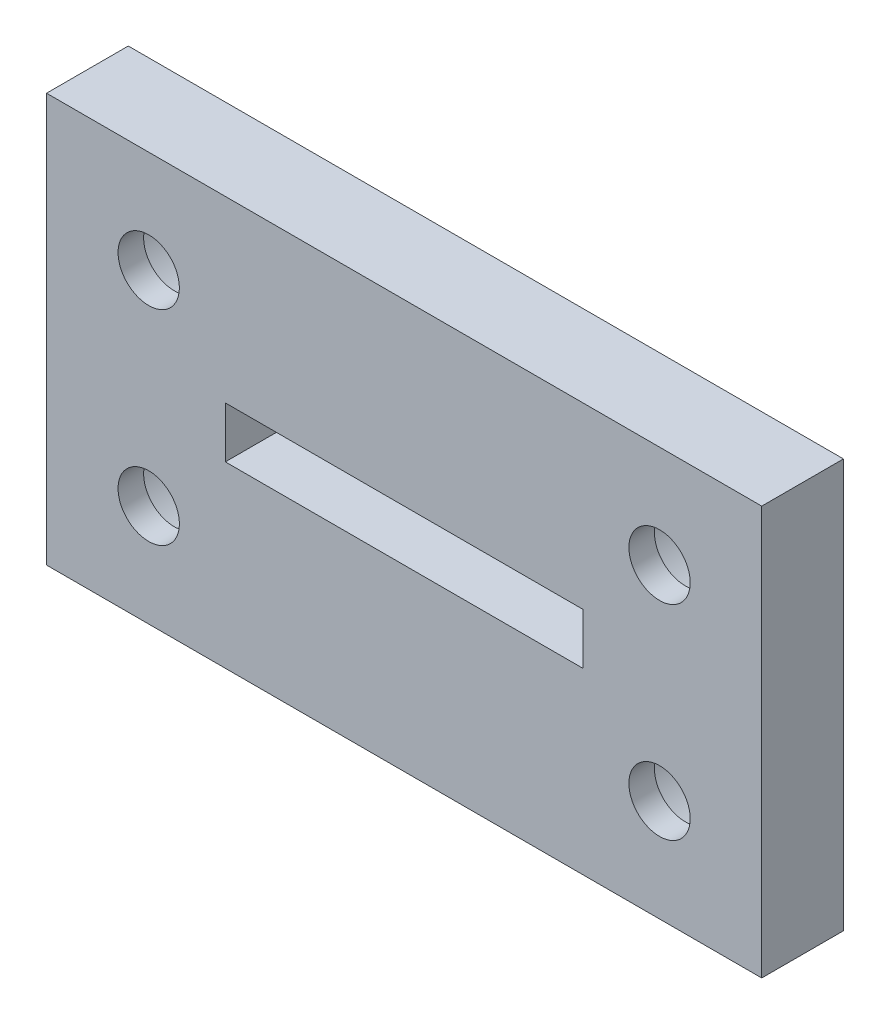
ISO-10303-21;
HEADER;
FILE_DESCRIPTION(('STEP AP214'),'2;1');
FILE_NAME('part.step','',(''),(''),'','','');
FILE_SCHEMA(('AUTOMOTIVE_DESIGN { 1 0 10303 214 1 1 1 1 }'));
ENDSEC;
DATA;
#1=APPLICATION_CONTEXT('core data for automotive mechanical design processes');
#2=APPLICATION_PROTOCOL_DEFINITION('international standard','automotive_design',2000,#1);
#3=PRODUCT_CONTEXT('',#1,'mechanical');
#4=PRODUCT('Part','Part','',(#3));
#5=PRODUCT_RELATED_PRODUCT_CATEGORY('part','',(#4));
#6=PRODUCT_DEFINITION_FORMATION('','',#4);
#7=PRODUCT_DEFINITION_CONTEXT('part definition',#1,'design');
#8=PRODUCT_DEFINITION('design','',#6,#7);
#9=PRODUCT_DEFINITION_SHAPE('','',#8);
#10=(LENGTH_UNIT() NAMED_UNIT(*) SI_UNIT(.MILLI.,.METRE.));
#11=(NAMED_UNIT(*) PLANE_ANGLE_UNIT() SI_UNIT($,.RADIAN.));
#12=(NAMED_UNIT(*) SI_UNIT($,.STERADIAN.) SOLID_ANGLE_UNIT());
#13=UNCERTAINTY_MEASURE_WITH_UNIT(LENGTH_MEASURE(1.E-05),#10,'distance_accuracy_value','');
#14=(GEOMETRIC_REPRESENTATION_CONTEXT(3) GLOBAL_UNCERTAINTY_ASSIGNED_CONTEXT((#13)) GLOBAL_UNIT_ASSIGNED_CONTEXT((#10,
#11,#12)) REPRESENTATION_CONTEXT('',''));
#15=CARTESIAN_POINT('',(0.,0.,0.));
#16=DIRECTION('',(0.,0.,1.));
#17=DIRECTION('',(1.,0.,0.));
#18=AXIS2_PLACEMENT_3D('',#15,#16,#17);
#19=CARTESIAN_POINT('',(4.,4.,3.2));
#20=DIRECTION('',(0.,0.,-1.));
#21=DIRECTION('',(-1.,0.,0.));
#22=AXIS2_PLACEMENT_3D('',#19,#20,#21);
#23=CYLINDRICAL_SURFACE('',#22,1.2);
#24=CARTESIAN_POINT('',(4.,4.,3.2));
#25=DIRECTION('',(0.,0.,1.));
#26=DIRECTION('',(-1.,0.,0.));
#27=AXIS2_PLACEMENT_3D('',#24,#25,#26);
#28=CIRCLE('',#27,1.2);
#29=CARTESIAN_POINT('',(2.8,4.,3.2));
#30=VERTEX_POINT('',#29);
#31=EDGE_CURVE('E196',#30,#30,#28,.T.);
#32=ORIENTED_EDGE('',*,*,#31,.T.);
#33=EDGE_LOOP('',(#32));
#34=FACE_BOUND('',#33,.T.);
#35=CARTESIAN_POINT('',(4.,4.,2.2));
#36=DIRECTION('',(0.,0.,-1.));
#37=DIRECTION('',(-1.,0.,0.));
#38=AXIS2_PLACEMENT_3D('',#35,#36,#37);
#39=CIRCLE('',#38,1.2);
#40=CARTESIAN_POINT('',(2.8,4.,2.2));
#41=VERTEX_POINT('',#40);
#42=EDGE_CURVE('E39',#41,#41,#39,.T.);
#43=ORIENTED_EDGE('',*,*,#42,.T.);
#44=EDGE_LOOP('',(#43));
#45=FACE_BOUND('',#44,.T.);
#46=ADVANCED_FACE('F35',(#34,#45),#23,.F.);
#47=CARTESIAN_POINT('',(24.,4.,3.2));
#48=DIRECTION('',(0.,0.,-1.));
#49=DIRECTION('',(-1.,0.,0.));
#50=AXIS2_PLACEMENT_3D('',#47,#48,#49);
#51=CYLINDRICAL_SURFACE('',#50,1.2);
#52=CARTESIAN_POINT('',(24.,4.,3.2));
#53=DIRECTION('',(0.,0.,1.));
#54=DIRECTION('',(1.,0.,0.));
#55=AXIS2_PLACEMENT_3D('',#52,#53,#54);
#56=CIRCLE('',#55,1.2);
#57=CARTESIAN_POINT('',(25.2,4.,3.2));
#58=VERTEX_POINT('',#57);
#59=EDGE_CURVE('E193',#58,#58,#56,.T.);
#60=ORIENTED_EDGE('',*,*,#59,.T.);
#61=EDGE_LOOP('',(#60));
#62=FACE_BOUND('',#61,.T.);
#63=CARTESIAN_POINT('',(24.,4.,2.2));
#64=DIRECTION('',(0.,0.,-1.));
#65=DIRECTION('',(-1.,0.,0.));
#66=AXIS2_PLACEMENT_3D('',#63,#64,#65);
#67=CIRCLE('',#66,1.2);
#68=CARTESIAN_POINT('',(22.8,4.,2.2));
#69=VERTEX_POINT('',#68);
#70=EDGE_CURVE('E174',#69,#69,#67,.T.);
#71=ORIENTED_EDGE('',*,*,#70,.T.);
#72=EDGE_LOOP('',(#71));
#73=FACE_BOUND('',#72,.T.);
#74=ADVANCED_FACE('F217',(#62,#73),#51,.F.);
#75=CARTESIAN_POINT('',(24.,12.,3.2));
#76=DIRECTION('',(0.,0.,-1.));
#77=DIRECTION('',(-1.,0.,0.));
#78=AXIS2_PLACEMENT_3D('',#75,#76,#77);
#79=CYLINDRICAL_SURFACE('',#78,1.2);
#80=CARTESIAN_POINT('',(24.,12.,3.2));
#81=DIRECTION('',(0.,0.,1.));
#82=DIRECTION('',(-1.,0.,0.));
#83=AXIS2_PLACEMENT_3D('',#80,#81,#82);
#84=CIRCLE('',#83,1.2);
#85=CARTESIAN_POINT('',(22.8,12.,3.2));
#86=VERTEX_POINT('',#85);
#87=EDGE_CURVE('E170',#86,#86,#84,.T.);
#88=ORIENTED_EDGE('',*,*,#87,.T.);
#89=EDGE_LOOP('',(#88));
#90=FACE_BOUND('',#89,.T.);
#91=CARTESIAN_POINT('',(24.,12.,2.2));
#92=DIRECTION('',(0.,0.,-1.));
#93=DIRECTION('',(-1.,0.,0.));
#94=AXIS2_PLACEMENT_3D('',#91,#92,#93);
#95=CIRCLE('',#94,1.2);
#96=CARTESIAN_POINT('',(22.8,12.,2.2));
#97=VERTEX_POINT('',#96);
#98=EDGE_CURVE('E172',#97,#97,#95,.T.);
#99=ORIENTED_EDGE('',*,*,#98,.T.);
#100=EDGE_LOOP('',(#99));
#101=FACE_BOUND('',#100,.T.);
#102=ADVANCED_FACE('F214',(#90,#101),#79,.F.);
#103=CARTESIAN_POINT('',(4.,12.,3.2));
#104=DIRECTION('',(0.,0.,-1.));
#105=DIRECTION('',(-1.,0.,0.));
#106=AXIS2_PLACEMENT_3D('',#103,#104,#105);
#107=CYLINDRICAL_SURFACE('',#106,1.2);
#108=CARTESIAN_POINT('',(4.,12.,3.2));
#109=DIRECTION('',(0.,0.,1.));
#110=DIRECTION('',(1.,0.,0.));
#111=AXIS2_PLACEMENT_3D('',#108,#109,#110);
#112=CIRCLE('',#111,1.2);
#113=CARTESIAN_POINT('',(5.2,12.,3.2));
#114=VERTEX_POINT('',#113);
#115=EDGE_CURVE('E132',#114,#114,#112,.T.);
#116=ORIENTED_EDGE('',*,*,#115,.T.);
#117=EDGE_LOOP('',(#116));
#118=FACE_BOUND('',#117,.T.);
#119=CARTESIAN_POINT('',(4.,12.,2.2));
#120=DIRECTION('',(0.,0.,-1.));
#121=DIRECTION('',(-1.,0.,0.));
#122=AXIS2_PLACEMENT_3D('',#119,#120,#121);
#123=CIRCLE('',#122,1.2);
#124=CARTESIAN_POINT('',(2.8,12.,2.2));
#125=VERTEX_POINT('',#124);
#126=EDGE_CURVE('E167',#125,#125,#123,.T.);
#127=ORIENTED_EDGE('',*,*,#126,.T.);
#128=EDGE_LOOP('',(#127));
#129=FACE_BOUND('',#128,.T.);
#130=ADVANCED_FACE('F201',(#118,#129),#107,.F.);
#131=CARTESIAN_POINT('',(0.,0.,3.2));
#132=DIRECTION('',(0.,0.,-1.));
#133=DIRECTION('',(-1.,0.,0.));
#134=AXIS2_PLACEMENT_3D('',#131,#132,#133);
#135=PLANE('',#134);
#136=DIRECTION('',(0.,-1.,0.));
#137=VECTOR('',#136,1.);
#138=CARTESIAN_POINT('',(0.,0.,3.2));
#139=LINE('',#138,#137);
#140=CARTESIAN_POINT('',(0.,16.,3.2));
#141=VERTEX_POINT('',#140);
#142=CARTESIAN_POINT('',(0.,0.,3.2));
#143=VERTEX_POINT('',#142);
#144=EDGE_CURVE('E142',#141,#143,#139,.T.);
#145=ORIENTED_EDGE('',*,*,#144,.T.);
#146=DIRECTION('',(1.,0.,0.));
#147=VECTOR('',#146,1.);
#148=CARTESIAN_POINT('',(0.,0.,3.2));
#149=LINE('',#148,#147);
#150=CARTESIAN_POINT('',(28.,0.,3.2));
#151=VERTEX_POINT('',#150);
#152=EDGE_CURVE('E145',#143,#151,#149,.T.);
#153=ORIENTED_EDGE('',*,*,#152,.T.);
#154=DIRECTION('',(0.,1.,0.));
#155=VECTOR('',#154,1.);
#156=CARTESIAN_POINT('',(28.,0.,3.2));
#157=LINE('',#156,#155);
#158=CARTESIAN_POINT('',(28.,16.,3.2));
#159=VERTEX_POINT('',#158);
#160=EDGE_CURVE('E148',#151,#159,#157,.T.);
#161=ORIENTED_EDGE('',*,*,#160,.T.);
#162=DIRECTION('',(-1.,0.,0.));
#163=VECTOR('',#162,1.);
#164=CARTESIAN_POINT('',(0.,16.,3.2));
#165=LINE('',#164,#163);
#166=EDGE_CURVE('E150',#159,#141,#165,.T.);
#167=ORIENTED_EDGE('',*,*,#166,.T.);
#168=EDGE_LOOP('',(#145,#153,#161,#167));
#169=FACE_BOUND('',#168,.T.);
#170=DIRECTION('',(0.,-1.,0.));
#171=VECTOR('',#170,1.);
#172=CARTESIAN_POINT('',(7.,7.,3.2));
#173=LINE('',#172,#171);
#174=CARTESIAN_POINT('',(7.,9.,3.2));
#175=VERTEX_POINT('',#174);
#176=CARTESIAN_POINT('',(7.,7.,3.2));
#177=VERTEX_POINT('',#176);
#178=EDGE_CURVE('E102',#175,#177,#173,.T.);
#179=ORIENTED_EDGE('',*,*,#178,.F.);
#180=DIRECTION('',(-1.,0.,0.));
#181=VECTOR('',#180,1.);
#182=CARTESIAN_POINT('',(7.,9.,3.2));
#183=LINE('',#182,#181);
#184=CARTESIAN_POINT('',(21.,9.,3.2));
#185=VERTEX_POINT('',#184);
#186=EDGE_CURVE('E126',#185,#175,#183,.T.);
#187=ORIENTED_EDGE('',*,*,#186,.F.);
#188=DIRECTION('',(0.,1.,0.));
#189=VECTOR('',#188,1.);
#190=CARTESIAN_POINT('',(21.,7.,3.2));
#191=LINE('',#190,#189);
#192=CARTESIAN_POINT('',(21.,7.,3.2));
#193=VERTEX_POINT('',#192);
#194=EDGE_CURVE('E124',#193,#185,#191,.T.);
#195=ORIENTED_EDGE('',*,*,#194,.F.);
#196=DIRECTION('',(1.,0.,0.));
#197=VECTOR('',#196,1.);
#198=CARTESIAN_POINT('',(7.,7.,3.2));
#199=LINE('',#198,#197);
#200=EDGE_CURVE('E110',#177,#193,#199,.T.);
#201=ORIENTED_EDGE('',*,*,#200,.F.);
#202=EDGE_LOOP('',(#179,#187,#195,#201));
#203=FACE_BOUND('',#202,.T.);
#204=ORIENTED_EDGE('',*,*,#115,.F.);
#205=EDGE_LOOP('',(#204));
#206=FACE_BOUND('',#205,.T.);
#207=ORIENTED_EDGE('',*,*,#31,.F.);
#208=EDGE_LOOP('',(#207));
#209=FACE_BOUND('',#208,.T.);
#210=ORIENTED_EDGE('',*,*,#59,.F.);
#211=EDGE_LOOP('',(#210));
#212=FACE_BOUND('',#211,.T.);
#213=ORIENTED_EDGE('',*,*,#87,.F.);
#214=EDGE_LOOP('',(#213));
#215=FACE_BOUND('',#214,.T.);
#216=ADVANCED_FACE('F122',(#169,#203,#206,#209,#212,#215),#135,.F.);
#217=CARTESIAN_POINT('',(0.,0.,0.));
#218=DIRECTION('',(0.,0.,-1.));
#219=DIRECTION('',(-1.,0.,0.));
#220=AXIS2_PLACEMENT_3D('',#217,#218,#219);
#221=PLANE('',#220);
#222=CARTESIAN_POINT('',(4.,4.,0.));
#223=DIRECTION('',(0.,0.,-1.));
#224=DIRECTION('',(-1.,0.,0.));
#225=AXIS2_PLACEMENT_3D('',#222,#223,#224);
#226=CIRCLE('',#225,3.);
#227=CARTESIAN_POINT('',(1.,4.,0.));
#228=VERTEX_POINT('',#227);
#229=EDGE_CURVE('E241',#228,#228,#226,.T.);
#230=ORIENTED_EDGE('',*,*,#229,.F.);
#231=EDGE_LOOP('',(#230));
#232=FACE_BOUND('',#231,.T.);
#233=CARTESIAN_POINT('',(24.,4.,0.));
#234=DIRECTION('',(0.,0.,-1.));
#235=DIRECTION('',(-1.,0.,0.));
#236=AXIS2_PLACEMENT_3D('',#233,#234,#235);
#237=CIRCLE('',#236,3.);
#238=CARTESIAN_POINT('',(21.,4.,0.));
#239=VERTEX_POINT('',#238);
#240=EDGE_CURVE('E231',#239,#239,#237,.T.);
#241=ORIENTED_EDGE('',*,*,#240,.F.);
#242=EDGE_LOOP('',(#241));
#243=FACE_BOUND('',#242,.T.);
#244=CARTESIAN_POINT('',(24.,12.,0.));
#245=DIRECTION('',(0.,0.,-1.));
#246=DIRECTION('',(-1.,0.,0.));
#247=AXIS2_PLACEMENT_3D('',#244,#245,#246);
#248=CIRCLE('',#247,3.);
#249=CARTESIAN_POINT('',(21.,12.,0.));
#250=VERTEX_POINT('',#249);
#251=EDGE_CURVE('E232',#250,#250,#248,.T.);
#252=ORIENTED_EDGE('',*,*,#251,.F.);
#253=EDGE_LOOP('',(#252));
#254=FACE_BOUND('',#253,.T.);
#255=CARTESIAN_POINT('',(4.,12.,0.));
#256=DIRECTION('',(0.,0.,-1.));
#257=DIRECTION('',(-1.,0.,0.));
#258=AXIS2_PLACEMENT_3D('',#255,#256,#257);
#259=CIRCLE('',#258,3.);
#260=CARTESIAN_POINT('',(1.,12.,0.));
#261=VERTEX_POINT('',#260);
#262=EDGE_CURVE('E180',#261,#261,#259,.T.);
#263=ORIENTED_EDGE('',*,*,#262,.F.);
#264=EDGE_LOOP('',(#263));
#265=FACE_BOUND('',#264,.T.);
#266=DIRECTION('',(0.,-1.,0.));
#267=VECTOR('',#266,1.);
#268=CARTESIAN_POINT('',(0.,0.,0.));
#269=LINE('',#268,#267);
#270=CARTESIAN_POINT('',(0.,16.,0.));
#271=VERTEX_POINT('',#270);
#272=CARTESIAN_POINT('',(0.,0.,0.));
#273=VERTEX_POINT('',#272);
#274=EDGE_CURVE('E118',#271,#273,#269,.T.);
#275=ORIENTED_EDGE('',*,*,#274,.F.);
#276=DIRECTION('',(-1.,0.,0.));
#277=VECTOR('',#276,1.);
#278=CARTESIAN_POINT('',(0.,16.,0.));
#279=LINE('',#278,#277);
#280=CARTESIAN_POINT('',(28.,16.,0.));
#281=VERTEX_POINT('',#280);
#282=EDGE_CURVE('E146',#281,#271,#279,.T.);
#283=ORIENTED_EDGE('',*,*,#282,.F.);
#284=DIRECTION('',(0.,1.,0.));
#285=VECTOR('',#284,1.);
#286=CARTESIAN_POINT('',(28.,0.,0.));
#287=LINE('',#286,#285);
#288=CARTESIAN_POINT('',(28.,0.,0.));
#289=VERTEX_POINT('',#288);
#290=EDGE_CURVE('E157',#289,#281,#287,.T.);
#291=ORIENTED_EDGE('',*,*,#290,.F.);
#292=DIRECTION('',(1.,0.,0.));
#293=VECTOR('',#292,1.);
#294=CARTESIAN_POINT('',(0.,0.,0.));
#295=LINE('',#294,#293);
#296=EDGE_CURVE('E155',#273,#289,#295,.T.);
#297=ORIENTED_EDGE('',*,*,#296,.F.);
#298=EDGE_LOOP('',(#275,#283,#291,#297));
#299=FACE_BOUND('',#298,.T.);
#300=DIRECTION('',(-1.,0.,0.));
#301=VECTOR('',#300,1.);
#302=CARTESIAN_POINT('',(7.,9.,0.));
#303=LINE('',#302,#301);
#304=CARTESIAN_POINT('',(21.,9.,0.));
#305=VERTEX_POINT('',#304);
#306=CARTESIAN_POINT('',(7.,9.,0.));
#307=VERTEX_POINT('',#306);
#308=EDGE_CURVE('E111',#305,#307,#303,.T.);
#309=ORIENTED_EDGE('',*,*,#308,.T.);
#310=DIRECTION('',(0.,-1.,0.));
#311=VECTOR('',#310,1.);
#312=CARTESIAN_POINT('',(7.,7.,0.));
#313=LINE('',#312,#311);
#314=CARTESIAN_POINT('',(7.,7.,0.));
#315=VERTEX_POINT('',#314);
#316=EDGE_CURVE('E60',#307,#315,#313,.T.);
#317=ORIENTED_EDGE('',*,*,#316,.T.);
#318=DIRECTION('',(1.,0.,0.));
#319=VECTOR('',#318,1.);
#320=CARTESIAN_POINT('',(7.,7.,0.));
#321=LINE('',#320,#319);
#322=CARTESIAN_POINT('',(21.,7.,0.));
#323=VERTEX_POINT('',#322);
#324=EDGE_CURVE('E117',#315,#323,#321,.T.);
#325=ORIENTED_EDGE('',*,*,#324,.T.);
#326=DIRECTION('',(0.,1.,0.));
#327=VECTOR('',#326,1.);
#328=CARTESIAN_POINT('',(21.,7.,0.));
#329=LINE('',#328,#327);
#330=EDGE_CURVE('E134',#323,#305,#329,.T.);
#331=ORIENTED_EDGE('',*,*,#330,.T.);
#332=EDGE_LOOP('',(#309,#317,#325,#331));
#333=FACE_BOUND('',#332,.T.);
#334=ADVANCED_FACE('F205',(#232,#243,#254,#265,#299,#333),#221,.T.);
#335=CARTESIAN_POINT('',(0.,0.,3.2));
#336=DIRECTION('',(1.,0.,0.));
#337=DIRECTION('',(0.,0.,-1.));
#338=AXIS2_PLACEMENT_3D('',#335,#336,#337);
#339=PLANE('',#338);
#340=ORIENTED_EDGE('',*,*,#274,.T.);
#341=DIRECTION('',(0.,0.,-1.));
#342=VECTOR('',#341,1.);
#343=CARTESIAN_POINT('',(0.,0.,3.2));
#344=LINE('',#343,#342);
#345=EDGE_CURVE('E11',#143,#273,#344,.T.);
#346=ORIENTED_EDGE('',*,*,#345,.F.);
#347=ORIENTED_EDGE('',*,*,#144,.F.);
#348=DIRECTION('',(0.,0.,-1.));
#349=VECTOR('',#348,1.);
#350=CARTESIAN_POINT('',(0.,16.,3.2));
#351=LINE('',#350,#349);
#352=EDGE_CURVE('E152',#141,#271,#351,.T.);
#353=ORIENTED_EDGE('',*,*,#352,.T.);
#354=EDGE_LOOP('',(#340,#346,#347,#353));
#355=FACE_BOUND('',#354,.T.);
#356=ADVANCED_FACE('F37',(#355),#339,.F.);
#357=CARTESIAN_POINT('',(0.,0.,3.2));
#358=DIRECTION('',(0.,1.,0.));
#359=DIRECTION('',(0.,0.,1.));
#360=AXIS2_PLACEMENT_3D('',#357,#358,#359);
#361=PLANE('',#360);
#362=ORIENTED_EDGE('',*,*,#296,.T.);
#363=DIRECTION('',(0.,0.,-1.));
#364=VECTOR('',#363,1.);
#365=CARTESIAN_POINT('',(28.,0.,3.2));
#366=LINE('',#365,#364);
#367=EDGE_CURVE('E44',#151,#289,#366,.T.);
#368=ORIENTED_EDGE('',*,*,#367,.F.);
#369=ORIENTED_EDGE('',*,*,#152,.F.);
#370=ORIENTED_EDGE('',*,*,#345,.T.);
#371=EDGE_LOOP('',(#362,#368,#369,#370));
#372=FACE_BOUND('',#371,.T.);
#373=ADVANCED_FACE('F311',(#372),#361,.F.);
#374=CARTESIAN_POINT('',(28.,0.,3.2));
#375=DIRECTION('',(-1.,0.,0.));
#376=DIRECTION('',(0.,0.,1.));
#377=AXIS2_PLACEMENT_3D('',#374,#375,#376);
#378=PLANE('',#377);
#379=ORIENTED_EDGE('',*,*,#290,.T.);
#380=DIRECTION('',(0.,0.,-1.));
#381=VECTOR('',#380,1.);
#382=CARTESIAN_POINT('',(28.,16.,3.2));
#383=LINE('',#382,#381);
#384=EDGE_CURVE('E162',#159,#281,#383,.T.);
#385=ORIENTED_EDGE('',*,*,#384,.F.);
#386=ORIENTED_EDGE('',*,*,#160,.F.);
#387=ORIENTED_EDGE('',*,*,#367,.T.);
#388=EDGE_LOOP('',(#379,#385,#386,#387));
#389=FACE_BOUND('',#388,.T.);
#390=ADVANCED_FACE('F318',(#389),#378,.F.);
#391=CARTESIAN_POINT('',(0.,16.,3.2));
#392=DIRECTION('',(0.,-1.,0.));
#393=DIRECTION('',(0.,0.,-1.));
#394=AXIS2_PLACEMENT_3D('',#391,#392,#393);
#395=PLANE('',#394);
#396=ORIENTED_EDGE('',*,*,#282,.T.);
#397=ORIENTED_EDGE('',*,*,#352,.F.);
#398=ORIENTED_EDGE('',*,*,#166,.F.);
#399=ORIENTED_EDGE('',*,*,#384,.T.);
#400=EDGE_LOOP('',(#396,#397,#398,#399));
#401=FACE_BOUND('',#400,.T.);
#402=ADVANCED_FACE('F325',(#401),#395,.F.);
#403=CARTESIAN_POINT('',(7.,7.,3.2));
#404=DIRECTION('',(1.,0.,0.));
#405=DIRECTION('',(0.,0.,-1.));
#406=AXIS2_PLACEMENT_3D('',#403,#404,#405);
#407=PLANE('',#406);
#408=ORIENTED_EDGE('',*,*,#316,.F.);
#409=DIRECTION('',(0.,0.,-1.));
#410=VECTOR('',#409,1.);
#411=CARTESIAN_POINT('',(7.,9.,3.2));
#412=LINE('',#411,#410);
#413=EDGE_CURVE('E106',#175,#307,#412,.T.);
#414=ORIENTED_EDGE('',*,*,#413,.F.);
#415=ORIENTED_EDGE('',*,*,#178,.T.);
#416=DIRECTION('',(0.,0.,-1.));
#417=VECTOR('',#416,1.);
#418=CARTESIAN_POINT('',(7.,7.,3.2));
#419=LINE('',#418,#417);
#420=EDGE_CURVE('E105',#177,#315,#419,.T.);
#421=ORIENTED_EDGE('',*,*,#420,.T.);
#422=EDGE_LOOP('',(#408,#414,#415,#421));
#423=FACE_BOUND('',#422,.T.);
#424=ADVANCED_FACE('F104',(#423),#407,.T.);
#425=CARTESIAN_POINT('',(7.,7.,3.2));
#426=DIRECTION('',(0.,1.,0.));
#427=DIRECTION('',(0.,0.,1.));
#428=AXIS2_PLACEMENT_3D('',#425,#426,#427);
#429=PLANE('',#428);
#430=ORIENTED_EDGE('',*,*,#324,.F.);
#431=ORIENTED_EDGE('',*,*,#420,.F.);
#432=ORIENTED_EDGE('',*,*,#200,.T.);
#433=DIRECTION('',(0.,0.,-1.));
#434=VECTOR('',#433,1.);
#435=CARTESIAN_POINT('',(21.,7.,3.2));
#436=LINE('',#435,#434);
#437=EDGE_CURVE('E119',#193,#323,#436,.T.);
#438=ORIENTED_EDGE('',*,*,#437,.T.);
#439=EDGE_LOOP('',(#430,#431,#432,#438));
#440=FACE_BOUND('',#439,.T.);
#441=ADVANCED_FACE('F114',(#440),#429,.T.);
#442=CARTESIAN_POINT('',(21.,7.,3.2));
#443=DIRECTION('',(-1.,0.,0.));
#444=DIRECTION('',(0.,0.,1.));
#445=AXIS2_PLACEMENT_3D('',#442,#443,#444);
#446=PLANE('',#445);
#447=ORIENTED_EDGE('',*,*,#330,.F.);
#448=ORIENTED_EDGE('',*,*,#437,.F.);
#449=ORIENTED_EDGE('',*,*,#194,.T.);
#450=DIRECTION('',(0.,0.,-1.));
#451=VECTOR('',#450,1.);
#452=CARTESIAN_POINT('',(21.,9.,3.2));
#453=LINE('',#452,#451);
#454=EDGE_CURVE('E52',#185,#305,#453,.T.);
#455=ORIENTED_EDGE('',*,*,#454,.T.);
#456=EDGE_LOOP('',(#447,#448,#449,#455));
#457=FACE_BOUND('',#456,.T.);
#458=ADVANCED_FACE('F271',(#457),#446,.T.);
#459=CARTESIAN_POINT('',(7.,9.,3.2));
#460=DIRECTION('',(0.,-1.,0.));
#461=DIRECTION('',(0.,0.,-1.));
#462=AXIS2_PLACEMENT_3D('',#459,#460,#461);
#463=PLANE('',#462);
#464=ORIENTED_EDGE('',*,*,#308,.F.);
#465=ORIENTED_EDGE('',*,*,#454,.F.);
#466=ORIENTED_EDGE('',*,*,#186,.T.);
#467=ORIENTED_EDGE('',*,*,#413,.T.);
#468=EDGE_LOOP('',(#464,#465,#466,#467));
#469=FACE_BOUND('',#468,.T.);
#470=ADVANCED_FACE('F268',(#469),#463,.T.);
#471=CARTESIAN_POINT('',(4.,12.,2.2));
#472=DIRECTION('',(0.,0.,-1.));
#473=DIRECTION('',(-1.,0.,0.));
#474=AXIS2_PLACEMENT_3D('',#471,#472,#473);
#475=CYLINDRICAL_SURFACE('',#474,3.);
#476=CARTESIAN_POINT('',(4.,12.,2.2));
#477=DIRECTION('',(0.,0.,-1.));
#478=DIRECTION('',(-1.,0.,0.));
#479=AXIS2_PLACEMENT_3D('',#476,#477,#478);
#480=CIRCLE('',#479,3.);
#481=CARTESIAN_POINT('',(1.,12.,2.2));
#482=VERTEX_POINT('',#481);
#483=EDGE_CURVE('E171',#482,#482,#480,.T.);
#484=ORIENTED_EDGE('',*,*,#483,.F.);
#485=EDGE_LOOP('',(#484));
#486=FACE_BOUND('',#485,.T.);
#487=ORIENTED_EDGE('',*,*,#262,.T.);
#488=EDGE_LOOP('',(#487));
#489=FACE_BOUND('',#488,.T.);
#490=ADVANCED_FACE('F270',(#486,#489),#475,.F.);
#491=CARTESIAN_POINT('',(4.,12.,2.2));
#492=DIRECTION('',(0.,0.,-1.));
#493=DIRECTION('',(-1.,0.,0.));
#494=AXIS2_PLACEMENT_3D('',#491,#492,#493);
#495=PLANE('',#494);
#496=ORIENTED_EDGE('',*,*,#126,.F.);
#497=EDGE_LOOP('',(#496));
#498=FACE_BOUND('',#497,.T.);
#499=ORIENTED_EDGE('',*,*,#483,.T.);
#500=EDGE_LOOP('',(#499));
#501=FACE_BOUND('',#500,.T.);
#502=ADVANCED_FACE('F277',(#498,#501),#495,.T.);
#503=CARTESIAN_POINT('',(24.,12.,2.2));
#504=DIRECTION('',(0.,0.,-1.));
#505=DIRECTION('',(-1.,0.,0.));
#506=AXIS2_PLACEMENT_3D('',#503,#504,#505);
#507=CYLINDRICAL_SURFACE('',#506,3.);
#508=CARTESIAN_POINT('',(24.,12.,2.2));
#509=DIRECTION('',(0.,0.,-1.));
#510=DIRECTION('',(-1.,0.,0.));
#511=AXIS2_PLACEMENT_3D('',#508,#509,#510);
#512=CIRCLE('',#511,3.);
#513=CARTESIAN_POINT('',(21.,12.,2.2));
#514=VERTEX_POINT('',#513);
#515=EDGE_CURVE('E229',#514,#514,#512,.T.);
#516=ORIENTED_EDGE('',*,*,#515,.F.);
#517=EDGE_LOOP('',(#516));
#518=FACE_BOUND('',#517,.T.);
#519=ORIENTED_EDGE('',*,*,#251,.T.);
#520=EDGE_LOOP('',(#519));
#521=FACE_BOUND('',#520,.T.);
#522=ADVANCED_FACE('F225',(#518,#521),#507,.F.);
#523=CARTESIAN_POINT('',(24.,12.,2.2));
#524=DIRECTION('',(0.,0.,-1.));
#525=DIRECTION('',(-1.,0.,0.));
#526=AXIS2_PLACEMENT_3D('',#523,#524,#525);
#527=PLANE('',#526);
#528=ORIENTED_EDGE('',*,*,#98,.F.);
#529=EDGE_LOOP('',(#528));
#530=FACE_BOUND('',#529,.T.);
#531=ORIENTED_EDGE('',*,*,#515,.T.);
#532=EDGE_LOOP('',(#531));
#533=FACE_BOUND('',#532,.T.);
#534=ADVANCED_FACE('F221',(#530,#533),#527,.T.);
#535=CARTESIAN_POINT('',(24.,4.,2.2));
#536=DIRECTION('',(0.,0.,-1.));
#537=DIRECTION('',(-1.,0.,0.));
#538=AXIS2_PLACEMENT_3D('',#535,#536,#537);
#539=CYLINDRICAL_SURFACE('',#538,3.);
#540=CARTESIAN_POINT('',(24.,4.,2.2));
#541=DIRECTION('',(0.,0.,-1.));
#542=DIRECTION('',(-1.,0.,0.));
#543=AXIS2_PLACEMENT_3D('',#540,#541,#542);
#544=CIRCLE('',#543,3.);
#545=CARTESIAN_POINT('',(21.,4.,2.2));
#546=VERTEX_POINT('',#545);
#547=EDGE_CURVE('E235',#546,#546,#544,.T.);
#548=ORIENTED_EDGE('',*,*,#547,.F.);
#549=EDGE_LOOP('',(#548));
#550=FACE_BOUND('',#549,.T.);
#551=ORIENTED_EDGE('',*,*,#240,.T.);
#552=EDGE_LOOP('',(#551));
#553=FACE_BOUND('',#552,.T.);
#554=ADVANCED_FACE('F224',(#550,#553),#539,.F.);
#555=CARTESIAN_POINT('',(24.,4.,2.2));
#556=DIRECTION('',(0.,0.,-1.));
#557=DIRECTION('',(-1.,0.,0.));
#558=AXIS2_PLACEMENT_3D('',#555,#556,#557);
#559=PLANE('',#558);
#560=ORIENTED_EDGE('',*,*,#70,.F.);
#561=EDGE_LOOP('',(#560));
#562=FACE_BOUND('',#561,.T.);
#563=ORIENTED_EDGE('',*,*,#547,.T.);
#564=EDGE_LOOP('',(#563));
#565=FACE_BOUND('',#564,.T.);
#566=ADVANCED_FACE('F252',(#562,#565),#559,.T.);
#567=CARTESIAN_POINT('',(4.,4.,2.2));
#568=DIRECTION('',(0.,0.,-1.));
#569=DIRECTION('',(-1.,0.,0.));
#570=AXIS2_PLACEMENT_3D('',#567,#568,#569);
#571=CYLINDRICAL_SURFACE('',#570,3.);
#572=CARTESIAN_POINT('',(4.,4.,2.2));
#573=DIRECTION('',(0.,0.,-1.));
#574=DIRECTION('',(-1.,0.,0.));
#575=AXIS2_PLACEMENT_3D('',#572,#573,#574);
#576=CIRCLE('',#575,3.);
#577=CARTESIAN_POINT('',(1.,4.,2.2));
#578=VERTEX_POINT('',#577);
#579=EDGE_CURVE('E175',#578,#578,#576,.T.);
#580=ORIENTED_EDGE('',*,*,#579,.F.);
#581=EDGE_LOOP('',(#580));
#582=FACE_BOUND('',#581,.T.);
#583=ORIENTED_EDGE('',*,*,#229,.T.);
#584=EDGE_LOOP('',(#583));
#585=FACE_BOUND('',#584,.T.);
#586=ADVANCED_FACE('F249',(#582,#585),#571,.F.);
#587=CARTESIAN_POINT('',(4.,4.,2.2));
#588=DIRECTION('',(0.,0.,-1.));
#589=DIRECTION('',(-1.,0.,0.));
#590=AXIS2_PLACEMENT_3D('',#587,#588,#589);
#591=PLANE('',#590);
#592=ORIENTED_EDGE('',*,*,#42,.F.);
#593=EDGE_LOOP('',(#592));
#594=FACE_BOUND('',#593,.T.);
#595=ORIENTED_EDGE('',*,*,#579,.T.);
#596=EDGE_LOOP('',(#595));
#597=FACE_BOUND('',#596,.T.);
#598=ADVANCED_FACE('F247',(#594,#597),#591,.T.);
#599=CLOSED_SHELL('',(#46,#74,#102,#130,#216,#334,#356,#373,#390,#402,#424,#441,#458,#470,#490,
#502,#522,#534,#554,#566,#586,#598));
#600=MANIFOLD_SOLID_BREP('B2',#599);
#601=ADVANCED_BREP_SHAPE_REPRESENTATION('',(#18,#600),#14);
#602=SHAPE_DEFINITION_REPRESENTATION(#9,#601);
ENDSEC;
END-ISO-10303-21;
